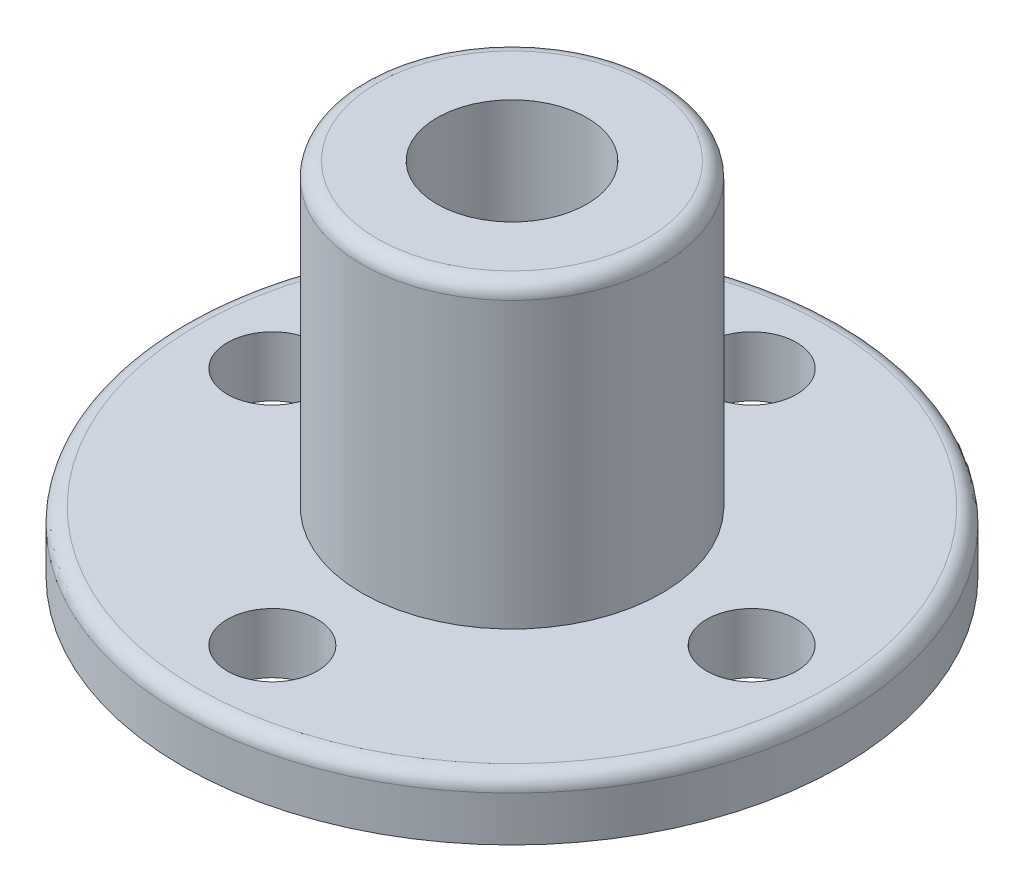
ISO-10303-21;
HEADER;
FILE_DESCRIPTION(('STEP AP214'),'2;1');
FILE_NAME('part.step','',(''),(''),'','','');
FILE_SCHEMA(('AUTOMOTIVE_DESIGN { 1 0 10303 214 1 1 1 1 }'));
ENDSEC;
DATA;
#1=APPLICATION_CONTEXT('core data for automotive mechanical design processes');
#2=APPLICATION_PROTOCOL_DEFINITION('international standard','automotive_design',2000,#1);
#3=PRODUCT_CONTEXT('',#1,'mechanical');
#4=PRODUCT('Part','Part','',(#3));
#5=PRODUCT_RELATED_PRODUCT_CATEGORY('part','',(#4));
#6=PRODUCT_DEFINITION_FORMATION('','',#4);
#7=PRODUCT_DEFINITION_CONTEXT('part definition',#1,'design');
#8=PRODUCT_DEFINITION('design','',#6,#7);
#9=PRODUCT_DEFINITION_SHAPE('','',#8);
#10=(LENGTH_UNIT() NAMED_UNIT(*) SI_UNIT(.MILLI.,.METRE.));
#11=(NAMED_UNIT(*) PLANE_ANGLE_UNIT() SI_UNIT($,.RADIAN.));
#12=(NAMED_UNIT(*) SI_UNIT($,.STERADIAN.) SOLID_ANGLE_UNIT());
#13=UNCERTAINTY_MEASURE_WITH_UNIT(LENGTH_MEASURE(1.E-05),#10,'distance_accuracy_value','');
#14=(GEOMETRIC_REPRESENTATION_CONTEXT(3) GLOBAL_UNCERTAINTY_ASSIGNED_CONTEXT((#13)) GLOBAL_UNIT_ASSIGNED_CONTEXT((#10,
#11,#12)) REPRESENTATION_CONTEXT('',''));
#15=CARTESIAN_POINT('',(0.,0.,0.));
#16=DIRECTION('',(0.,0.,1.));
#17=DIRECTION('',(1.,0.,0.));
#18=AXIS2_PLACEMENT_3D('',#15,#16,#17);
#19=CARTESIAN_POINT('',(0.,2.,0.));
#20=DIRECTION('',(0.,-1.,0.));
#21=DIRECTION('',(0.,0.,-1.));
#22=AXIS2_PLACEMENT_3D('',#19,#20,#21);
#23=CYLINDRICAL_SURFACE('',#22,11.);
#24=CARTESIAN_POINT('',(0.,1.5,0.));
#25=DIRECTION('',(0.,1.,0.));
#26=DIRECTION('',(0.,0.,1.));
#27=AXIS2_PLACEMENT_3D('',#24,#25,#26);
#28=CIRCLE('',#27,11.);
#29=CARTESIAN_POINT('',(0.,1.5,11.));
#30=VERTEX_POINT('',#29);
#31=EDGE_CURVE('E10',#30,#30,#28,.F.);
#32=ORIENTED_EDGE('',*,*,#31,.T.);
#33=EDGE_LOOP('',(#32));
#34=FACE_BOUND('',#33,.T.);
#35=CARTESIAN_POINT('',(0.,0.,0.));
#36=DIRECTION('',(0.,1.,0.));
#37=DIRECTION('',(0.,0.,1.));
#38=AXIS2_PLACEMENT_3D('',#35,#36,#37);
#39=CIRCLE('',#38,11.);
#40=CARTESIAN_POINT('',(0.,0.,11.));
#41=VERTEX_POINT('',#40);
#42=EDGE_CURVE('E58',#41,#41,#39,.T.);
#43=ORIENTED_EDGE('',*,*,#42,.T.);
#44=EDGE_LOOP('',(#43));
#45=FACE_BOUND('',#44,.T.);
#46=ADVANCED_FACE('F37',(#34,#45),#23,.T.);
#47=CARTESIAN_POINT('',(0.,2.,0.));
#48=DIRECTION('',(0.,1.,0.));
#49=DIRECTION('',(0.,0.,1.));
#50=AXIS2_PLACEMENT_3D('',#47,#48,#49);
#51=PLANE('',#50);
#52=CARTESIAN_POINT('',(0.,2.,0.));
#53=DIRECTION('',(0.,1.,0.));
#54=DIRECTION('',(0.,0.,1.));
#55=AXIS2_PLACEMENT_3D('',#52,#53,#54);
#56=CIRCLE('',#55,10.5);
#57=CARTESIAN_POINT('',(0.,2.,10.5));
#58=VERTEX_POINT('',#57);
#59=EDGE_CURVE('E44',#58,#58,#56,.T.);
#60=ORIENTED_EDGE('',*,*,#59,.T.);
#61=EDGE_LOOP('',(#60));
#62=FACE_BOUND('',#61,.T.);
#63=CARTESIAN_POINT('',(0.,2.,-8.));
#64=DIRECTION('',(0.,1.,0.));
#65=DIRECTION('',(0.,0.,1.));
#66=AXIS2_PLACEMENT_3D('',#63,#64,#65);
#67=CIRCLE('',#66,1.50000000000001);
#68=CARTESIAN_POINT('',(0.,2.,-6.49999999999999));
#69=VERTEX_POINT('',#68);
#70=EDGE_CURVE('E90',#69,#69,#67,.T.);
#71=ORIENTED_EDGE('',*,*,#70,.F.);
#72=EDGE_LOOP('',(#71));
#73=FACE_BOUND('',#72,.T.);
#74=CARTESIAN_POINT('',(8.,2.,0.));
#75=DIRECTION('',(0.,1.,0.));
#76=DIRECTION('',(0.,0.,1.));
#77=AXIS2_PLACEMENT_3D('',#74,#75,#76);
#78=CIRCLE('',#77,1.50000000000001);
#79=CARTESIAN_POINT('',(8.,2.,1.50000000000001));
#80=VERTEX_POINT('',#79);
#81=EDGE_CURVE('E84',#80,#80,#78,.T.);
#82=ORIENTED_EDGE('',*,*,#81,.F.);
#83=EDGE_LOOP('',(#82));
#84=FACE_BOUND('',#83,.T.);
#85=CARTESIAN_POINT('',(0.,2.,8.));
#86=DIRECTION('',(0.,1.,0.));
#87=DIRECTION('',(0.,0.,1.));
#88=AXIS2_PLACEMENT_3D('',#85,#86,#87);
#89=CIRCLE('',#88,1.50000000000001);
#90=CARTESIAN_POINT('',(0.,2.,9.50000000000001));
#91=VERTEX_POINT('',#90);
#92=EDGE_CURVE('E78',#91,#91,#89,.T.);
#93=ORIENTED_EDGE('',*,*,#92,.F.);
#94=EDGE_LOOP('',(#93));
#95=FACE_BOUND('',#94,.T.);
#96=CARTESIAN_POINT('',(-8.,2.,0.));
#97=DIRECTION('',(0.,1.,0.));
#98=DIRECTION('',(0.,0.,1.));
#99=AXIS2_PLACEMENT_3D('',#96,#97,#98);
#100=CIRCLE('',#99,1.50000000000001);
#101=CARTESIAN_POINT('',(-8.,2.,1.50000000000001));
#102=VERTEX_POINT('',#101);
#103=EDGE_CURVE('E72',#102,#102,#100,.T.);
#104=ORIENTED_EDGE('',*,*,#103,.F.);
#105=EDGE_LOOP('',(#104));
#106=FACE_BOUND('',#105,.T.);
#107=CARTESIAN_POINT('',(0.,2.,0.));
#108=DIRECTION('',(0.,1.,0.));
#109=DIRECTION('',(0.,0.,1.));
#110=AXIS2_PLACEMENT_3D('',#107,#108,#109);
#111=CIRCLE('',#110,5.);
#112=CARTESIAN_POINT('',(0.,2.,5.));
#113=VERTEX_POINT('',#112);
#114=EDGE_CURVE('E57',#113,#113,#111,.T.);
#115=ORIENTED_EDGE('',*,*,#114,.F.);
#116=EDGE_LOOP('',(#115));
#117=FACE_BOUND('',#116,.T.);
#118=ADVANCED_FACE('F96',(#62,#73,#84,#95,#106,#117),#51,.T.);
#119=CARTESIAN_POINT('',(0.,0.,0.));
#120=DIRECTION('',(0.,1.,0.));
#121=DIRECTION('',(0.,0.,1.));
#122=AXIS2_PLACEMENT_3D('',#119,#120,#121);
#123=PLANE('',#122);
#124=CARTESIAN_POINT('',(0.,0.,-8.));
#125=DIRECTION('',(0.,1.,0.));
#126=DIRECTION('',(0.,0.,1.));
#127=AXIS2_PLACEMENT_3D('',#124,#125,#126);
#128=CIRCLE('',#127,1.50000000000001);
#129=CARTESIAN_POINT('',(0.,0.,-6.49999999999999));
#130=VERTEX_POINT('',#129);
#131=EDGE_CURVE('E87',#130,#130,#128,.T.);
#132=ORIENTED_EDGE('',*,*,#131,.T.);
#133=EDGE_LOOP('',(#132));
#134=FACE_BOUND('',#133,.T.);
#135=CARTESIAN_POINT('',(8.,0.,0.));
#136=DIRECTION('',(0.,1.,0.));
#137=DIRECTION('',(0.,0.,1.));
#138=AXIS2_PLACEMENT_3D('',#135,#136,#137);
#139=CIRCLE('',#138,1.50000000000001);
#140=CARTESIAN_POINT('',(8.,0.,1.50000000000001));
#141=VERTEX_POINT('',#140);
#142=EDGE_CURVE('E81',#141,#141,#139,.T.);
#143=ORIENTED_EDGE('',*,*,#142,.T.);
#144=EDGE_LOOP('',(#143));
#145=FACE_BOUND('',#144,.T.);
#146=CARTESIAN_POINT('',(0.,0.,8.));
#147=DIRECTION('',(0.,1.,0.));
#148=DIRECTION('',(0.,0.,1.));
#149=AXIS2_PLACEMENT_3D('',#146,#147,#148);
#150=CIRCLE('',#149,1.50000000000001);
#151=CARTESIAN_POINT('',(0.,0.,9.50000000000001));
#152=VERTEX_POINT('',#151);
#153=EDGE_CURVE('E75',#152,#152,#150,.T.);
#154=ORIENTED_EDGE('',*,*,#153,.T.);
#155=EDGE_LOOP('',(#154));
#156=FACE_BOUND('',#155,.T.);
#157=CARTESIAN_POINT('',(-8.,0.,0.));
#158=DIRECTION('',(0.,1.,0.));
#159=DIRECTION('',(0.,0.,1.));
#160=AXIS2_PLACEMENT_3D('',#157,#158,#159);
#161=CIRCLE('',#160,1.50000000000001);
#162=CARTESIAN_POINT('',(-8.,0.,1.50000000000001));
#163=VERTEX_POINT('',#162);
#164=EDGE_CURVE('E67',#163,#163,#161,.T.);
#165=ORIENTED_EDGE('',*,*,#164,.T.);
#166=EDGE_LOOP('',(#165));
#167=FACE_BOUND('',#166,.T.);
#168=ORIENTED_EDGE('',*,*,#42,.F.);
#169=EDGE_LOOP('',(#168));
#170=FACE_BOUND('',#169,.T.);
#171=ADVANCED_FACE('F99',(#134,#145,#156,#167,#170),#123,.F.);
#172=CARTESIAN_POINT('',(0.,12.,0.));
#173=DIRECTION('',(0.,-1.,0.));
#174=DIRECTION('',(0.,0.,-1.));
#175=AXIS2_PLACEMENT_3D('',#172,#173,#174);
#176=CYLINDRICAL_SURFACE('',#175,5.);
#177=CARTESIAN_POINT('',(0.,11.5,0.));
#178=DIRECTION('',(0.,1.,0.));
#179=DIRECTION('',(0.,0.,1.));
#180=AXIS2_PLACEMENT_3D('',#177,#178,#179);
#181=CIRCLE('',#180,5.);
#182=CARTESIAN_POINT('',(0.,11.5,5.));
#183=VERTEX_POINT('',#182);
#184=EDGE_CURVE('E48',#183,#183,#181,.F.);
#185=ORIENTED_EDGE('',*,*,#184,.T.);
#186=EDGE_LOOP('',(#185));
#187=FACE_BOUND('',#186,.T.);
#188=ORIENTED_EDGE('',*,*,#114,.T.);
#189=EDGE_LOOP('',(#188));
#190=FACE_BOUND('',#189,.T.);
#191=ADVANCED_FACE('F109',(#187,#190),#176,.T.);
#192=CARTESIAN_POINT('',(0.,12.,0.));
#193=DIRECTION('',(0.,1.,0.));
#194=DIRECTION('',(0.,0.,1.));
#195=AXIS2_PLACEMENT_3D('',#192,#193,#194);
#196=PLANE('',#195);
#197=CARTESIAN_POINT('',(0.,12.,0.));
#198=DIRECTION('',(0.,1.,0.));
#199=DIRECTION('',(0.,0.,1.));
#200=AXIS2_PLACEMENT_3D('',#197,#198,#199);
#201=CIRCLE('',#200,4.5);
#202=CARTESIAN_POINT('',(0.,12.,4.5));
#203=VERTEX_POINT('',#202);
#204=EDGE_CURVE('E52',#203,#203,#201,.T.);
#205=ORIENTED_EDGE('',*,*,#204,.T.);
#206=EDGE_LOOP('',(#205));
#207=FACE_BOUND('',#206,.T.);
#208=CARTESIAN_POINT('',(0.,12.,0.));
#209=DIRECTION('',(0.,1.,0.));
#210=DIRECTION('',(0.,0.,1.));
#211=AXIS2_PLACEMENT_3D('',#208,#209,#210);
#212=CIRCLE('',#211,2.5);
#213=CARTESIAN_POINT('',(0.,12.,2.5));
#214=VERTEX_POINT('',#213);
#215=EDGE_CURVE('E64',#214,#214,#212,.T.);
#216=ORIENTED_EDGE('',*,*,#215,.F.);
#217=EDGE_LOOP('',(#216));
#218=FACE_BOUND('',#217,.T.);
#219=ADVANCED_FACE('F111',(#207,#218),#196,.T.);
#220=CARTESIAN_POINT('',(0.,2.,0.));
#221=DIRECTION('',(0.,1.,0.));
#222=DIRECTION('',(0.,0.,1.));
#223=AXIS2_PLACEMENT_3D('',#220,#221,#222);
#224=CYLINDRICAL_SURFACE('',#223,2.5);
#225=CARTESIAN_POINT('',(0.,2.,0.));
#226=DIRECTION('',(0.,1.,0.));
#227=DIRECTION('',(0.,0.,1.));
#228=AXIS2_PLACEMENT_3D('',#225,#226,#227);
#229=CIRCLE('',#228,2.5);
#230=CARTESIAN_POINT('',(0.,2.,2.5));
#231=VERTEX_POINT('',#230);
#232=EDGE_CURVE('E61',#231,#231,#229,.T.);
#233=ORIENTED_EDGE('',*,*,#232,.F.);
#234=EDGE_LOOP('',(#233));
#235=FACE_BOUND('',#234,.T.);
#236=ORIENTED_EDGE('',*,*,#215,.T.);
#237=EDGE_LOOP('',(#236));
#238=FACE_BOUND('',#237,.T.);
#239=ADVANCED_FACE('F117',(#235,#238),#224,.F.);
#240=CARTESIAN_POINT('',(0.,2.,0.));
#241=DIRECTION('',(0.,1.,0.));
#242=DIRECTION('',(0.,0.,1.));
#243=AXIS2_PLACEMENT_3D('',#240,#241,#242);
#244=PLANE('',#243);
#245=ORIENTED_EDGE('',*,*,#232,.T.);
#246=EDGE_LOOP('',(#245));
#247=FACE_BOUND('',#246,.T.);
#248=ADVANCED_FACE('F146',(#247),#244,.T.);
#249=CARTESIAN_POINT('',(-8.,2.,0.));
#250=DIRECTION('',(0.,1.,0.));
#251=DIRECTION('',(0.,0.,1.));
#252=AXIS2_PLACEMENT_3D('',#249,#250,#251);
#253=CYLINDRICAL_SURFACE('',#252,1.50000000000001);
#254=ORIENTED_EDGE('',*,*,#164,.F.);
#255=EDGE_LOOP('',(#254));
#256=FACE_BOUND('',#255,.T.);
#257=ORIENTED_EDGE('',*,*,#103,.T.);
#258=EDGE_LOOP('',(#257));
#259=FACE_BOUND('',#258,.T.);
#260=ADVANCED_FACE('F152',(#256,#259),#253,.F.);
#261=CARTESIAN_POINT('',(0.,2.,8.));
#262=DIRECTION('',(0.,1.,0.));
#263=DIRECTION('',(0.,0.,1.));
#264=AXIS2_PLACEMENT_3D('',#261,#262,#263);
#265=CYLINDRICAL_SURFACE('',#264,1.50000000000001);
#266=ORIENTED_EDGE('',*,*,#153,.F.);
#267=EDGE_LOOP('',(#266));
#268=FACE_BOUND('',#267,.T.);
#269=ORIENTED_EDGE('',*,*,#92,.T.);
#270=EDGE_LOOP('',(#269));
#271=FACE_BOUND('',#270,.T.);
#272=ADVANCED_FACE('F159',(#268,#271),#265,.F.);
#273=CARTESIAN_POINT('',(8.,2.,0.));
#274=DIRECTION('',(0.,1.,0.));
#275=DIRECTION('',(0.,0.,1.));
#276=AXIS2_PLACEMENT_3D('',#273,#274,#275);
#277=CYLINDRICAL_SURFACE('',#276,1.50000000000001);
#278=ORIENTED_EDGE('',*,*,#142,.F.);
#279=EDGE_LOOP('',(#278));
#280=FACE_BOUND('',#279,.T.);
#281=ORIENTED_EDGE('',*,*,#81,.T.);
#282=EDGE_LOOP('',(#281));
#283=FACE_BOUND('',#282,.T.);
#284=ADVANCED_FACE('F136',(#280,#283),#277,.F.);
#285=CARTESIAN_POINT('',(0.,2.,-8.));
#286=DIRECTION('',(0.,1.,0.));
#287=DIRECTION('',(0.,0.,1.));
#288=AXIS2_PLACEMENT_3D('',#285,#286,#287);
#289=CYLINDRICAL_SURFACE('',#288,1.50000000000001);
#290=ORIENTED_EDGE('',*,*,#131,.F.);
#291=EDGE_LOOP('',(#290));
#292=FACE_BOUND('',#291,.T.);
#293=ORIENTED_EDGE('',*,*,#70,.T.);
#294=EDGE_LOOP('',(#293));
#295=FACE_BOUND('',#294,.T.);
#296=ADVANCED_FACE('F94',(#292,#295),#289,.F.);
#297=CARTESIAN_POINT('',(0.,11.5,0.));
#298=DIRECTION('',(0.,1.,0.));
#299=DIRECTION('',(0.,0.,1.));
#300=AXIS2_PLACEMENT_3D('',#297,#298,#299);
#301=TOROIDAL_SURFACE('',#300,4.5,0.5);
#302=ORIENTED_EDGE('',*,*,#184,.F.);
#303=EDGE_LOOP('',(#302));
#304=FACE_BOUND('',#303,.T.);
#305=ORIENTED_EDGE('',*,*,#204,.F.);
#306=EDGE_LOOP('',(#305));
#307=FACE_BOUND('',#306,.T.);
#308=ADVANCED_FACE('F129',(#304,#307),#301,.T.);
#309=CARTESIAN_POINT('',(0.,1.5,0.));
#310=DIRECTION('',(0.,1.,0.));
#311=DIRECTION('',(0.,0.,1.));
#312=AXIS2_PLACEMENT_3D('',#309,#310,#311);
#313=TOROIDAL_SURFACE('',#312,10.5,0.5);
#314=ORIENTED_EDGE('',*,*,#31,.F.);
#315=EDGE_LOOP('',(#314));
#316=FACE_BOUND('',#315,.T.);
#317=ORIENTED_EDGE('',*,*,#59,.F.);
#318=EDGE_LOOP('',(#317));
#319=FACE_BOUND('',#318,.T.);
#320=ADVANCED_FACE('F39',(#316,#319),#313,.T.);
#321=CLOSED_SHELL('',(#46,#118,#171,#191,#219,#239,#248,#260,#272,#284,#296,#308,#320));
#322=MANIFOLD_SOLID_BREP('B2',#321);
#323=ADVANCED_BREP_SHAPE_REPRESENTATION('',(#18,#322),#14);
#324=SHAPE_DEFINITION_REPRESENTATION(#9,#323);
ENDSEC;
END-ISO-10303-21;
